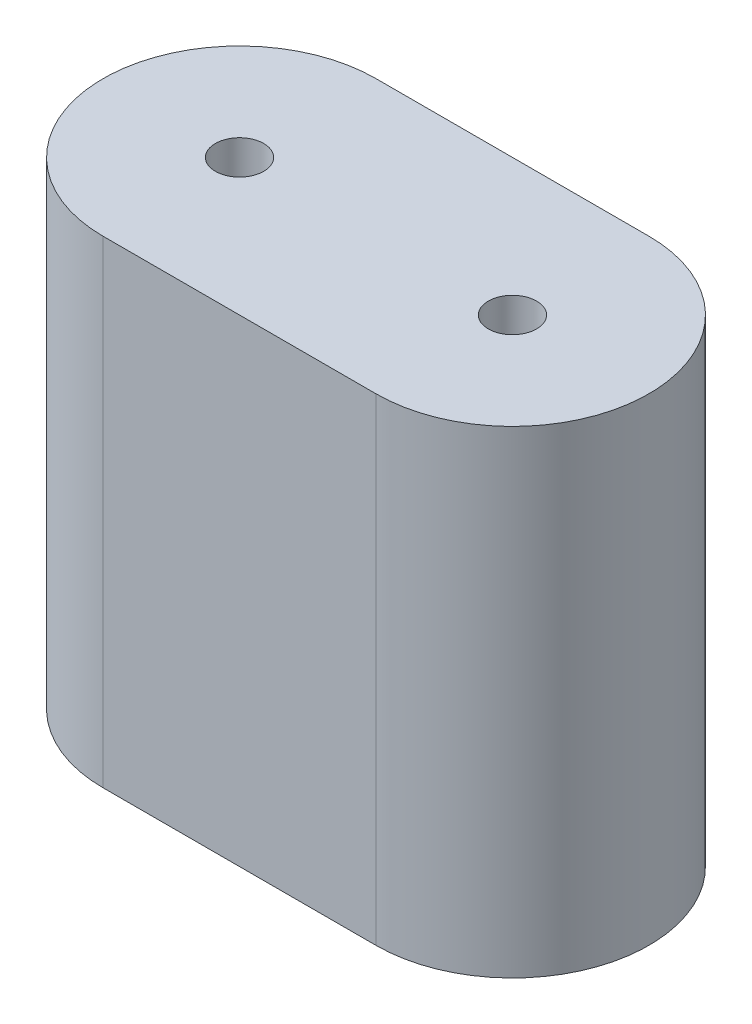
ISO-10303-21;
HEADER;
FILE_DESCRIPTION(('STEP AP214'),'2;1');
FILE_NAME('part.step','',(''),(''),'','','');
FILE_SCHEMA(('AUTOMOTIVE_DESIGN { 1 0 10303 214 1 1 1 1 }'));
ENDSEC;
DATA;
#1=APPLICATION_CONTEXT('core data for automotive mechanical design processes');
#2=APPLICATION_PROTOCOL_DEFINITION('international standard','automotive_design',2000,#1);
#3=PRODUCT_CONTEXT('',#1,'mechanical');
#4=PRODUCT('Part','Part','',(#3));
#5=PRODUCT_RELATED_PRODUCT_CATEGORY('part','',(#4));
#6=PRODUCT_DEFINITION_FORMATION('','',#4);
#7=PRODUCT_DEFINITION_CONTEXT('part definition',#1,'design');
#8=PRODUCT_DEFINITION('design','',#6,#7);
#9=PRODUCT_DEFINITION_SHAPE('','',#8);
#10=(LENGTH_UNIT() NAMED_UNIT(*) SI_UNIT(.MILLI.,.METRE.));
#11=(NAMED_UNIT(*) PLANE_ANGLE_UNIT() SI_UNIT($,.RADIAN.));
#12=(NAMED_UNIT(*) SI_UNIT($,.STERADIAN.) SOLID_ANGLE_UNIT());
#13=UNCERTAINTY_MEASURE_WITH_UNIT(LENGTH_MEASURE(1.E-05),#10,'distance_accuracy_value','');
#14=(GEOMETRIC_REPRESENTATION_CONTEXT(3) GLOBAL_UNCERTAINTY_ASSIGNED_CONTEXT((#13)) GLOBAL_UNIT_ASSIGNED_CONTEXT((#10,
#11,#12)) REPRESENTATION_CONTEXT('',''));
#15=CARTESIAN_POINT('',(0.,0.,0.));
#16=DIRECTION('',(0.,0.,1.));
#17=DIRECTION('',(1.,0.,0.));
#18=AXIS2_PLACEMENT_3D('',#15,#16,#17);
#19=CARTESIAN_POINT('',(-12.7,44.45,0.));
#20=DIRECTION('',(0.,-1.,0.));
#21=DIRECTION('',(0.,0.,-1.));
#22=AXIS2_PLACEMENT_3D('',#19,#20,#21);
#23=CYLINDRICAL_SURFACE('',#22,12.7);
#24=CARTESIAN_POINT('',(-12.7,0.,0.));
#25=DIRECTION('',(0.,1.,0.));
#26=DIRECTION('',(0.,0.,1.));
#27=AXIS2_PLACEMENT_3D('',#24,#25,#26);
#28=CIRCLE('',#27,12.7);
#29=CARTESIAN_POINT('',(-12.7,0.,-12.7));
#30=VERTEX_POINT('',#29);
#31=CARTESIAN_POINT('',(-12.7,0.,12.7));
#32=VERTEX_POINT('',#31);
#33=EDGE_CURVE('E99',#30,#32,#28,.T.);
#34=ORIENTED_EDGE('',*,*,#33,.T.);
#35=DIRECTION('',(0.,-1.,0.));
#36=VECTOR('',#35,1.);
#37=CARTESIAN_POINT('',(-12.7,44.45,12.7));
#38=LINE('',#37,#36);
#39=CARTESIAN_POINT('',(-12.7,44.45,12.7));
#40=VERTEX_POINT('',#39);
#41=EDGE_CURVE('E11',#40,#32,#38,.T.);
#42=ORIENTED_EDGE('',*,*,#41,.F.);
#43=CARTESIAN_POINT('',(-12.7,44.45,0.));
#44=DIRECTION('',(0.,1.,0.));
#45=DIRECTION('',(0.,0.,1.));
#46=AXIS2_PLACEMENT_3D('',#43,#44,#45);
#47=CIRCLE('',#46,12.7);
#48=CARTESIAN_POINT('',(-12.7,44.45,-12.7));
#49=VERTEX_POINT('',#48);
#50=EDGE_CURVE('E87',#49,#40,#47,.T.);
#51=ORIENTED_EDGE('',*,*,#50,.F.);
#52=DIRECTION('',(0.,-1.,0.));
#53=VECTOR('',#52,1.);
#54=CARTESIAN_POINT('',(-12.7,44.45,-12.7));
#55=LINE('',#54,#53);
#56=EDGE_CURVE('E95',#49,#30,#55,.T.);
#57=ORIENTED_EDGE('',*,*,#56,.T.);
#58=EDGE_LOOP('',(#34,#42,#51,#57));
#59=FACE_BOUND('',#58,.T.);
#60=ADVANCED_FACE('F36',(#59),#23,.T.);
#61=CARTESIAN_POINT('',(12.7,44.45,12.7));
#62=DIRECTION('',(0.,0.,-1.));
#63=DIRECTION('',(-1.,0.,0.));
#64=AXIS2_PLACEMENT_3D('',#61,#62,#63);
#65=PLANE('',#64);
#66=DIRECTION('',(1.,0.,0.));
#67=VECTOR('',#66,1.);
#68=CARTESIAN_POINT('',(12.7,0.,12.7));
#69=LINE('',#68,#67);
#70=CARTESIAN_POINT('',(12.7,0.,12.7));
#71=VERTEX_POINT('',#70);
#72=EDGE_CURVE('E91',#32,#71,#69,.T.);
#73=ORIENTED_EDGE('',*,*,#72,.T.);
#74=DIRECTION('',(0.,-1.,0.));
#75=VECTOR('',#74,1.);
#76=CARTESIAN_POINT('',(12.7,44.45,12.7));
#77=LINE('',#76,#75);
#78=CARTESIAN_POINT('',(12.7,44.45,12.7));
#79=VERTEX_POINT('',#78);
#80=EDGE_CURVE('E44',#79,#71,#77,.T.);
#81=ORIENTED_EDGE('',*,*,#80,.F.);
#82=DIRECTION('',(1.,0.,0.));
#83=VECTOR('',#82,1.);
#84=CARTESIAN_POINT('',(12.7,44.45,12.7));
#85=LINE('',#84,#83);
#86=EDGE_CURVE('E82',#40,#79,#85,.T.);
#87=ORIENTED_EDGE('',*,*,#86,.F.);
#88=ORIENTED_EDGE('',*,*,#41,.T.);
#89=EDGE_LOOP('',(#73,#81,#87,#88));
#90=FACE_BOUND('',#89,.T.);
#91=ADVANCED_FACE('F90',(#90),#65,.F.);
#92=CARTESIAN_POINT('',(12.7,44.45,0.));
#93=DIRECTION('',(0.,-1.,0.));
#94=DIRECTION('',(0.,0.,-1.));
#95=AXIS2_PLACEMENT_3D('',#92,#93,#94);
#96=CYLINDRICAL_SURFACE('',#95,12.7);
#97=CARTESIAN_POINT('',(12.7,0.,0.));
#98=DIRECTION('',(0.,1.,0.));
#99=DIRECTION('',(0.,0.,-1.));
#100=AXIS2_PLACEMENT_3D('',#97,#98,#99);
#101=CIRCLE('',#100,12.7);
#102=CARTESIAN_POINT('',(12.7,0.,-12.7));
#103=VERTEX_POINT('',#102);
#104=EDGE_CURVE('E69',#71,#103,#101,.T.);
#105=ORIENTED_EDGE('',*,*,#104,.T.);
#106=DIRECTION('',(0.,-1.,0.));
#107=VECTOR('',#106,1.);
#108=CARTESIAN_POINT('',(12.7,44.45,-12.7));
#109=LINE('',#108,#107);
#110=CARTESIAN_POINT('',(12.7,44.45,-12.7));
#111=VERTEX_POINT('',#110);
#112=EDGE_CURVE('E92',#111,#103,#109,.T.);
#113=ORIENTED_EDGE('',*,*,#112,.F.);
#114=CARTESIAN_POINT('',(12.7,44.45,0.));
#115=DIRECTION('',(0.,1.,0.));
#116=DIRECTION('',(0.,0.,-1.));
#117=AXIS2_PLACEMENT_3D('',#114,#115,#116);
#118=CIRCLE('',#117,12.7);
#119=EDGE_CURVE('E85',#79,#111,#118,.T.);
#120=ORIENTED_EDGE('',*,*,#119,.F.);
#121=ORIENTED_EDGE('',*,*,#80,.T.);
#122=EDGE_LOOP('',(#105,#113,#120,#121));
#123=FACE_BOUND('',#122,.T.);
#124=ADVANCED_FACE('F93',(#123),#96,.T.);
#125=CARTESIAN_POINT('',(-12.7,44.45,-12.7));
#126=DIRECTION('',(0.,0.,1.));
#127=DIRECTION('',(1.,0.,0.));
#128=AXIS2_PLACEMENT_3D('',#125,#126,#127);
#129=PLANE('',#128);
#130=DIRECTION('',(-1.,0.,0.));
#131=VECTOR('',#130,1.);
#132=CARTESIAN_POINT('',(-12.7,0.,-12.7));
#133=LINE('',#132,#131);
#134=EDGE_CURVE('E75',#103,#30,#133,.T.);
#135=ORIENTED_EDGE('',*,*,#134,.T.);
#136=ORIENTED_EDGE('',*,*,#56,.F.);
#137=DIRECTION('',(-1.,0.,0.));
#138=VECTOR('',#137,1.);
#139=CARTESIAN_POINT('',(-12.7,44.45,-12.7));
#140=LINE('',#139,#138);
#141=EDGE_CURVE('E52',#111,#49,#140,.T.);
#142=ORIENTED_EDGE('',*,*,#141,.F.);
#143=ORIENTED_EDGE('',*,*,#112,.T.);
#144=EDGE_LOOP('',(#135,#136,#142,#143));
#145=FACE_BOUND('',#144,.T.);
#146=ADVANCED_FACE('F107',(#145),#129,.F.);
#147=CARTESIAN_POINT('',(-12.7,44.45,0.));
#148=DIRECTION('',(0.,1.,0.));
#149=DIRECTION('',(0.,0.,1.));
#150=AXIS2_PLACEMENT_3D('',#147,#148,#149);
#151=PLANE('',#150);
#152=CARTESIAN_POINT('',(12.7,44.45,0.));
#153=DIRECTION('',(0.,-1.,0.));
#154=DIRECTION('',(0.,0.,-1.));
#155=AXIS2_PLACEMENT_3D('',#152,#153,#154);
#156=CIRCLE('',#155,2.24789999999999);
#157=CARTESIAN_POINT('',(12.7,44.45,-2.24789999999999));
#158=VERTEX_POINT('',#157);
#159=EDGE_CURVE('E118',#158,#158,#156,.T.);
#160=ORIENTED_EDGE('',*,*,#159,.T.);
#161=EDGE_LOOP('',(#160));
#162=FACE_BOUND('',#161,.T.);
#163=CARTESIAN_POINT('',(-12.7,44.45,0.));
#164=DIRECTION('',(0.,-1.,0.));
#165=DIRECTION('',(0.,0.,-1.));
#166=AXIS2_PLACEMENT_3D('',#163,#164,#165);
#167=CIRCLE('',#166,2.24789999999999);
#168=CARTESIAN_POINT('',(-12.7,44.45,-2.24789999999999));
#169=VERTEX_POINT('',#168);
#170=EDGE_CURVE('E102',#169,#169,#167,.T.);
#171=ORIENTED_EDGE('',*,*,#170,.T.);
#172=EDGE_LOOP('',(#171));
#173=FACE_BOUND('',#172,.T.);
#174=ORIENTED_EDGE('',*,*,#50,.T.);
#175=ORIENTED_EDGE('',*,*,#86,.T.);
#176=ORIENTED_EDGE('',*,*,#119,.T.);
#177=ORIENTED_EDGE('',*,*,#141,.T.);
#178=EDGE_LOOP('',(#174,#175,#176,#177));
#179=FACE_BOUND('',#178,.T.);
#180=ADVANCED_FACE('F83',(#162,#173,#179),#151,.T.);
#181=CARTESIAN_POINT('',(-12.7,0.,0.));
#182=DIRECTION('',(0.,1.,0.));
#183=DIRECTION('',(0.,0.,1.));
#184=AXIS2_PLACEMENT_3D('',#181,#182,#183);
#185=PLANE('',#184);
#186=CARTESIAN_POINT('',(12.7,0.,0.));
#187=DIRECTION('',(0.,-1.,0.));
#188=DIRECTION('',(0.,0.,-1.));
#189=AXIS2_PLACEMENT_3D('',#186,#187,#188);
#190=CIRCLE('',#189,2.2479);
#191=CARTESIAN_POINT('',(12.7,0.,-2.2479));
#192=VERTEX_POINT('',#191);
#193=EDGE_CURVE('E121',#192,#192,#190,.T.);
#194=ORIENTED_EDGE('',*,*,#193,.F.);
#195=EDGE_LOOP('',(#194));
#196=FACE_BOUND('',#195,.T.);
#197=CARTESIAN_POINT('',(-12.7,0.,0.));
#198=DIRECTION('',(0.,-1.,0.));
#199=DIRECTION('',(0.,0.,-1.));
#200=AXIS2_PLACEMENT_3D('',#197,#198,#199);
#201=CIRCLE('',#200,2.2479);
#202=CARTESIAN_POINT('',(-12.7,0.,-2.2479));
#203=VERTEX_POINT('',#202);
#204=EDGE_CURVE('E115',#203,#203,#201,.T.);
#205=ORIENTED_EDGE('',*,*,#204,.F.);
#206=EDGE_LOOP('',(#205));
#207=FACE_BOUND('',#206,.T.);
#208=ORIENTED_EDGE('',*,*,#33,.F.);
#209=ORIENTED_EDGE('',*,*,#134,.F.);
#210=ORIENTED_EDGE('',*,*,#104,.F.);
#211=ORIENTED_EDGE('',*,*,#72,.F.);
#212=EDGE_LOOP('',(#208,#209,#210,#211));
#213=FACE_BOUND('',#212,.T.);
#214=ADVANCED_FACE('F110',(#196,#207,#213),#185,.F.);
#215=CARTESIAN_POINT('',(-12.7,0.,0.));
#216=DIRECTION('',(0.,-1.,0.));
#217=DIRECTION('',(0.,0.,-1.));
#218=AXIS2_PLACEMENT_3D('',#215,#216,#217);
#219=CYLINDRICAL_SURFACE('',#218,2.24789999999999);
#220=ORIENTED_EDGE('',*,*,#170,.F.);
#221=EDGE_LOOP('',(#220));
#222=FACE_BOUND('',#221,.T.);
#223=ORIENTED_EDGE('',*,*,#204,.T.);
#224=EDGE_LOOP('',(#223));
#225=FACE_BOUND('',#224,.T.);
#226=ADVANCED_FACE('F129',(#222,#225),#219,.F.);
#227=CARTESIAN_POINT('',(12.7,0.,0.));
#228=DIRECTION('',(0.,-1.,0.));
#229=DIRECTION('',(0.,0.,-1.));
#230=AXIS2_PLACEMENT_3D('',#227,#228,#229);
#231=CYLINDRICAL_SURFACE('',#230,2.24789999999999);
#232=ORIENTED_EDGE('',*,*,#159,.F.);
#233=EDGE_LOOP('',(#232));
#234=FACE_BOUND('',#233,.T.);
#235=ORIENTED_EDGE('',*,*,#193,.T.);
#236=EDGE_LOOP('',(#235));
#237=FACE_BOUND('',#236,.T.);
#238=ADVANCED_FACE('F125',(#234,#237),#231,.F.);
#239=CLOSED_SHELL('',(#60,#91,#124,#146,#180,#214,#226,#238));
#240=MANIFOLD_SOLID_BREP('B2',#239);
#241=ADVANCED_BREP_SHAPE_REPRESENTATION('',(#18,#240),#14);
#242=SHAPE_DEFINITION_REPRESENTATION(#9,#241);
ENDSEC;
END-ISO-10303-21;
